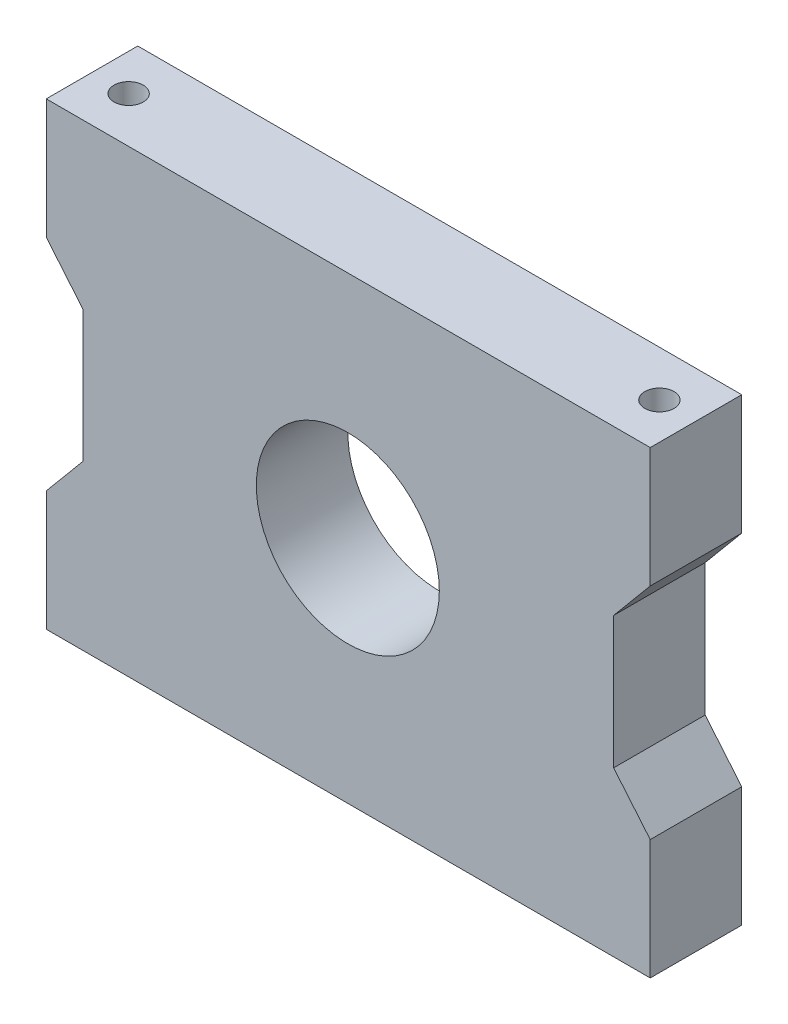
ISO-10303-21;
HEADER;
FILE_DESCRIPTION(('STEP AP214'),'2;1');
FILE_NAME('part.step','',(''),(''),'','','');
FILE_SCHEMA(('AUTOMOTIVE_DESIGN { 1 0 10303 214 1 1 1 1 }'));
ENDSEC;
DATA;
#1=APPLICATION_CONTEXT('core data for automotive mechanical design processes');
#2=APPLICATION_PROTOCOL_DEFINITION('international standard','automotive_design',2000,#1);
#3=PRODUCT_CONTEXT('',#1,'mechanical');
#4=PRODUCT('Part','Part','',(#3));
#5=PRODUCT_RELATED_PRODUCT_CATEGORY('part','',(#4));
#6=PRODUCT_DEFINITION_FORMATION('','',#4);
#7=PRODUCT_DEFINITION_CONTEXT('part definition',#1,'design');
#8=PRODUCT_DEFINITION('design','',#6,#7);
#9=PRODUCT_DEFINITION_SHAPE('','',#8);
#10=(LENGTH_UNIT() NAMED_UNIT(*) SI_UNIT(.MILLI.,.METRE.));
#11=(NAMED_UNIT(*) PLANE_ANGLE_UNIT() SI_UNIT($,.RADIAN.));
#12=(NAMED_UNIT(*) SI_UNIT($,.STERADIAN.) SOLID_ANGLE_UNIT());
#13=UNCERTAINTY_MEASURE_WITH_UNIT(LENGTH_MEASURE(1.E-05),#10,'distance_accuracy_value','');
#14=(GEOMETRIC_REPRESENTATION_CONTEXT(3) GLOBAL_UNCERTAINTY_ASSIGNED_CONTEXT((#13)) GLOBAL_UNIT_ASSIGNED_CONTEXT((#10,
#11,#12)) REPRESENTATION_CONTEXT('',''));
#15=CARTESIAN_POINT('',(0.,0.,0.));
#16=DIRECTION('',(0.,0.,1.));
#17=DIRECTION('',(1.,0.,0.));
#18=AXIS2_PLACEMENT_3D('',#15,#16,#17);
#19=CARTESIAN_POINT('',(0.,0.,10.));
#20=DIRECTION('',(0.,0.,1.));
#21=DIRECTION('',(1.,0.,0.));
#22=AXIS2_PLACEMENT_3D('',#19,#20,#21);
#23=PLANE('',#22);
#24=DIRECTION('',(0.,-1.,0.));
#25=VECTOR('',#24,1.);
#26=CARTESIAN_POINT('',(0.,0.,10.));
#27=LINE('',#26,#25);
#28=CARTESIAN_POINT('',(0.,13.1,10.));
#29=VERTEX_POINT('',#28);
#30=CARTESIAN_POINT('',(0.,0.,10.));
#31=VERTEX_POINT('',#30);
#32=EDGE_CURVE('E202',#29,#31,#27,.T.);
#33=ORIENTED_EDGE('',*,*,#32,.T.);
#34=DIRECTION('',(1.,0.,0.));
#35=VECTOR('',#34,1.);
#36=CARTESIAN_POINT('',(0.,0.,10.));
#37=LINE('',#36,#35);
#38=CARTESIAN_POINT('',(66.,0.,10.));
#39=VERTEX_POINT('',#38);
#40=EDGE_CURVE('E114',#31,#39,#37,.T.);
#41=ORIENTED_EDGE('',*,*,#40,.T.);
#42=DIRECTION('',(0.,1.,0.));
#43=VECTOR('',#42,1.);
#44=CARTESIAN_POINT('',(66.,0.,10.));
#45=LINE('',#44,#43);
#46=CARTESIAN_POINT('',(66.,13.1,10.));
#47=VERTEX_POINT('',#46);
#48=EDGE_CURVE('E239',#39,#47,#45,.T.);
#49=ORIENTED_EDGE('',*,*,#48,.T.);
#50=DIRECTION('',(-0.641215926832567,0.767360498837575,0.));
#51=VECTOR('',#50,1.);
#52=CARTESIAN_POINT('',(66.,13.1,10.));
#53=LINE('',#52,#51);
#54=CARTESIAN_POINT('',(62.,17.8869085387703,10.));
#55=VERTEX_POINT('',#54);
#56=EDGE_CURVE('E259',#47,#55,#53,.T.);
#57=ORIENTED_EDGE('',*,*,#56,.T.);
#58=DIRECTION('',(0.,1.,0.));
#59=VECTOR('',#58,1.);
#60=CARTESIAN_POINT('',(62.,17.8869085387703,10.));
#61=LINE('',#60,#59);
#62=CARTESIAN_POINT('',(62.,32.3130914612297,10.));
#63=VERTEX_POINT('',#62);
#64=EDGE_CURVE('E255',#55,#63,#61,.T.);
#65=ORIENTED_EDGE('',*,*,#64,.T.);
#66=DIRECTION('',(0.641215926832567,0.767360498837575,0.));
#67=VECTOR('',#66,1.);
#68=CARTESIAN_POINT('',(66.,37.1,10.));
#69=LINE('',#68,#67);
#70=CARTESIAN_POINT('',(66.,37.1,10.));
#71=VERTEX_POINT('',#70);
#72=EDGE_CURVE('E258',#63,#71,#69,.T.);
#73=ORIENTED_EDGE('',*,*,#72,.T.);
#74=DIRECTION('',(0.,1.,0.));
#75=VECTOR('',#74,1.);
#76=CARTESIAN_POINT('',(66.,50.2,10.));
#77=LINE('',#76,#75);
#78=CARTESIAN_POINT('',(66.,50.2,10.));
#79=VERTEX_POINT('',#78);
#80=EDGE_CURVE('E263',#71,#79,#77,.T.);
#81=ORIENTED_EDGE('',*,*,#80,.T.);
#82=DIRECTION('',(-1.,0.,0.));
#83=VECTOR('',#82,1.);
#84=CARTESIAN_POINT('',(66.,50.2,10.));
#85=LINE('',#84,#83);
#86=CARTESIAN_POINT('',(0.,50.2,10.));
#87=VERTEX_POINT('',#86);
#88=EDGE_CURVE('E270',#79,#87,#85,.T.);
#89=ORIENTED_EDGE('',*,*,#88,.T.);
#90=DIRECTION('',(0.,-1.,0.));
#91=VECTOR('',#90,1.);
#92=CARTESIAN_POINT('',(0.,50.2,10.));
#93=LINE('',#92,#91);
#94=CARTESIAN_POINT('',(0.,37.1,10.));
#95=VERTEX_POINT('',#94);
#96=EDGE_CURVE('E145',#87,#95,#93,.T.);
#97=ORIENTED_EDGE('',*,*,#96,.T.);
#98=DIRECTION('',(0.641215926832567,-0.767360498837575,0.));
#99=VECTOR('',#98,1.);
#100=CARTESIAN_POINT('',(0.,37.1,10.));
#101=LINE('',#100,#99);
#102=CARTESIAN_POINT('',(4.,32.3130914612297,10.));
#103=VERTEX_POINT('',#102);
#104=EDGE_CURVE('E139',#95,#103,#101,.T.);
#105=ORIENTED_EDGE('',*,*,#104,.T.);
#106=DIRECTION('',(0.,-1.,0.));
#107=VECTOR('',#106,1.);
#108=CARTESIAN_POINT('',(4.,17.8869085387703,10.));
#109=LINE('',#108,#107);
#110=CARTESIAN_POINT('',(4.,17.8869085387703,10.));
#111=VERTEX_POINT('',#110);
#112=EDGE_CURVE('E143',#103,#111,#109,.T.);
#113=ORIENTED_EDGE('',*,*,#112,.T.);
#114=DIRECTION('',(-0.641215926832567,-0.767360498837575,0.));
#115=VECTOR('',#114,1.);
#116=CARTESIAN_POINT('',(0.,13.1,10.));
#117=LINE('',#116,#115);
#118=EDGE_CURVE('E59',#111,#29,#117,.T.);
#119=ORIENTED_EDGE('',*,*,#118,.T.);
#120=EDGE_LOOP('',(#33,#41,#49,#57,#65,#73,#81,#89,#97,#105,#113,#119));
#121=FACE_BOUND('',#120,.T.);
#122=CARTESIAN_POINT('',(32.9524080393924,25.1,10.));
#123=DIRECTION('',(0.,0.,1.));
#124=DIRECTION('',(1.,0.,0.));
#125=AXIS2_PLACEMENT_3D('',#122,#123,#124);
#126=CIRCLE('',#125,10.);
#127=CARTESIAN_POINT('',(42.9524080393924,25.1,10.));
#128=VERTEX_POINT('',#127);
#129=EDGE_CURVE('E172',#128,#128,#126,.T.);
#130=ORIENTED_EDGE('',*,*,#129,.F.);
#131=EDGE_LOOP('',(#130));
#132=FACE_BOUND('',#131,.T.);
#133=ADVANCED_FACE('F41',(#121,#132),#23,.T.);
#134=CARTESIAN_POINT('',(0.,0.,0.));
#135=DIRECTION('',(0.,0.,1.));
#136=DIRECTION('',(1.,0.,0.));
#137=AXIS2_PLACEMENT_3D('',#134,#135,#136);
#138=PLANE('',#137);
#139=DIRECTION('',(0.,-1.,0.));
#140=VECTOR('',#139,1.);
#141=CARTESIAN_POINT('',(0.,0.,0.));
#142=LINE('',#141,#140);
#143=CARTESIAN_POINT('',(0.,13.1,0.));
#144=VERTEX_POINT('',#143);
#145=CARTESIAN_POINT('',(0.,0.,0.));
#146=VERTEX_POINT('',#145);
#147=EDGE_CURVE('E167',#144,#146,#142,.T.);
#148=ORIENTED_EDGE('',*,*,#147,.F.);
#149=DIRECTION('',(-0.641215926832567,-0.767360498837575,0.));
#150=VECTOR('',#149,1.);
#151=CARTESIAN_POINT('',(0.,13.1,0.));
#152=LINE('',#151,#150);
#153=CARTESIAN_POINT('',(4.,17.8869085387703,0.));
#154=VERTEX_POINT('',#153);
#155=EDGE_CURVE('E106',#154,#144,#152,.T.);
#156=ORIENTED_EDGE('',*,*,#155,.F.);
#157=DIRECTION('',(0.,-1.,0.));
#158=VECTOR('',#157,1.);
#159=CARTESIAN_POINT('',(4.,17.8869085387703,0.));
#160=LINE('',#159,#158);
#161=CARTESIAN_POINT('',(4.,32.3130914612297,0.));
#162=VERTEX_POINT('',#161);
#163=EDGE_CURVE('E100',#162,#154,#160,.T.);
#164=ORIENTED_EDGE('',*,*,#163,.F.);
#165=DIRECTION('',(0.641215926832567,-0.767360498837575,0.));
#166=VECTOR('',#165,1.);
#167=CARTESIAN_POINT('',(0.,37.1,0.));
#168=LINE('',#167,#166);
#169=CARTESIAN_POINT('',(0.,37.1,0.));
#170=VERTEX_POINT('',#169);
#171=EDGE_CURVE('E154',#170,#162,#168,.T.);
#172=ORIENTED_EDGE('',*,*,#171,.F.);
#173=DIRECTION('',(0.,-1.,0.));
#174=VECTOR('',#173,1.);
#175=CARTESIAN_POINT('',(0.,50.2,0.));
#176=LINE('',#175,#174);
#177=CARTESIAN_POINT('',(0.,50.2,0.));
#178=VERTEX_POINT('',#177);
#179=EDGE_CURVE('E193',#178,#170,#176,.T.);
#180=ORIENTED_EDGE('',*,*,#179,.F.);
#181=DIRECTION('',(-1.,0.,0.));
#182=VECTOR('',#181,1.);
#183=CARTESIAN_POINT('',(66.,50.2,0.));
#184=LINE('',#183,#182);
#185=CARTESIAN_POINT('',(66.,50.2,0.));
#186=VERTEX_POINT('',#185);
#187=EDGE_CURVE('E190',#186,#178,#184,.T.);
#188=ORIENTED_EDGE('',*,*,#187,.F.);
#189=DIRECTION('',(0.,1.,0.));
#190=VECTOR('',#189,1.);
#191=CARTESIAN_POINT('',(66.,50.2,0.));
#192=LINE('',#191,#190);
#193=CARTESIAN_POINT('',(66.,37.1,0.));
#194=VERTEX_POINT('',#193);
#195=EDGE_CURVE('E187',#194,#186,#192,.T.);
#196=ORIENTED_EDGE('',*,*,#195,.F.);
#197=DIRECTION('',(0.641215926832567,0.767360498837575,0.));
#198=VECTOR('',#197,1.);
#199=CARTESIAN_POINT('',(66.,37.1,0.));
#200=LINE('',#199,#198);
#201=CARTESIAN_POINT('',(62.,32.3130914612297,0.));
#202=VERTEX_POINT('',#201);
#203=EDGE_CURVE('E184',#202,#194,#200,.T.);
#204=ORIENTED_EDGE('',*,*,#203,.F.);
#205=DIRECTION('',(0.,1.,0.));
#206=VECTOR('',#205,1.);
#207=CARTESIAN_POINT('',(62.,17.8869085387703,0.));
#208=LINE('',#207,#206);
#209=CARTESIAN_POINT('',(62.,17.8869085387703,0.));
#210=VERTEX_POINT('',#209);
#211=EDGE_CURVE('E181',#210,#202,#208,.T.);
#212=ORIENTED_EDGE('',*,*,#211,.F.);
#213=DIRECTION('',(-0.641215926832567,0.767360498837575,0.));
#214=VECTOR('',#213,1.);
#215=CARTESIAN_POINT('',(66.,13.1,0.));
#216=LINE('',#215,#214);
#217=CARTESIAN_POINT('',(66.,13.1,0.));
#218=VERTEX_POINT('',#217);
#219=EDGE_CURVE('E178',#218,#210,#216,.T.);
#220=ORIENTED_EDGE('',*,*,#219,.F.);
#221=DIRECTION('',(0.,1.,0.));
#222=VECTOR('',#221,1.);
#223=CARTESIAN_POINT('',(66.,0.,0.));
#224=LINE('',#223,#222);
#225=CARTESIAN_POINT('',(66.,0.,0.));
#226=VERTEX_POINT('',#225);
#227=EDGE_CURVE('E175',#226,#218,#224,.T.);
#228=ORIENTED_EDGE('',*,*,#227,.F.);
#229=DIRECTION('',(1.,0.,0.));
#230=VECTOR('',#229,1.);
#231=CARTESIAN_POINT('',(0.,0.,0.));
#232=LINE('',#231,#230);
#233=EDGE_CURVE('E171',#146,#226,#232,.T.);
#234=ORIENTED_EDGE('',*,*,#233,.F.);
#235=EDGE_LOOP('',(#148,#156,#164,#172,#180,#188,#196,#204,#212,#220,#228,#234));
#236=FACE_BOUND('',#235,.T.);
#237=CARTESIAN_POINT('',(32.9524080393924,25.1,0.));
#238=DIRECTION('',(0.,0.,1.));
#239=DIRECTION('',(1.,0.,0.));
#240=AXIS2_PLACEMENT_3D('',#237,#238,#239);
#241=CIRCLE('',#240,10.);
#242=CARTESIAN_POINT('',(42.9524080393924,25.1,0.));
#243=VERTEX_POINT('',#242);
#244=EDGE_CURVE('E364',#243,#243,#241,.T.);
#245=ORIENTED_EDGE('',*,*,#244,.T.);
#246=EDGE_LOOP('',(#245));
#247=FACE_BOUND('',#246,.T.);
#248=ADVANCED_FACE('F243',(#236,#247),#138,.F.);
#249=CARTESIAN_POINT('',(0.,0.,10.));
#250=DIRECTION('',(1.,0.,0.));
#251=DIRECTION('',(0.,0.,-1.));
#252=AXIS2_PLACEMENT_3D('',#249,#250,#251);
#253=PLANE('',#252);
#254=ORIENTED_EDGE('',*,*,#147,.T.);
#255=DIRECTION('',(0.,0.,-1.));
#256=VECTOR('',#255,1.);
#257=CARTESIAN_POINT('',(0.,0.,10.));
#258=LINE('',#257,#256);
#259=EDGE_CURVE('E11',#31,#146,#258,.T.);
#260=ORIENTED_EDGE('',*,*,#259,.F.);
#261=ORIENTED_EDGE('',*,*,#32,.F.);
#262=DIRECTION('',(0.,0.,-1.));
#263=VECTOR('',#262,1.);
#264=CARTESIAN_POINT('',(0.,13.1,10.));
#265=LINE('',#264,#263);
#266=EDGE_CURVE('E163',#29,#144,#265,.T.);
#267=ORIENTED_EDGE('',*,*,#266,.T.);
#268=EDGE_LOOP('',(#254,#260,#261,#267));
#269=FACE_BOUND('',#268,.T.);
#270=ADVANCED_FACE('F43',(#269),#253,.F.);
#271=CARTESIAN_POINT('',(0.,0.,10.));
#272=DIRECTION('',(0.,1.,0.));
#273=DIRECTION('',(0.,0.,1.));
#274=AXIS2_PLACEMENT_3D('',#271,#272,#273);
#275=PLANE('',#274);
#276=CARTESIAN_POINT('',(4.,0.,5.));
#277=DIRECTION('',(0.,1.,0.));
#278=DIRECTION('',(0.,0.,1.));
#279=AXIS2_PLACEMENT_3D('',#276,#277,#278);
#280=CIRCLE('',#279,1.6);
#281=CARTESIAN_POINT('',(4.,0.,6.6));
#282=VERTEX_POINT('',#281);
#283=EDGE_CURVE('E342',#282,#282,#280,.T.);
#284=ORIENTED_EDGE('',*,*,#283,.T.);
#285=EDGE_LOOP('',(#284));
#286=FACE_BOUND('',#285,.T.);
#287=CARTESIAN_POINT('',(62.,0.,4.99999999999999));
#288=DIRECTION('',(0.,1.,0.));
#289=DIRECTION('',(0.,0.,-1.));
#290=AXIS2_PLACEMENT_3D('',#287,#288,#289);
#291=CIRCLE('',#290,1.60000000000001);
#292=CARTESIAN_POINT('',(62.,0.,3.39999999999999));
#293=VERTEX_POINT('',#292);
#294=EDGE_CURVE('E356',#293,#293,#291,.T.);
#295=ORIENTED_EDGE('',*,*,#294,.T.);
#296=EDGE_LOOP('',(#295));
#297=FACE_BOUND('',#296,.T.);
#298=ORIENTED_EDGE('',*,*,#233,.T.);
#299=DIRECTION('',(0.,0.,-1.));
#300=VECTOR('',#299,1.);
#301=CARTESIAN_POINT('',(66.,0.,10.));
#302=LINE('',#301,#300);
#303=EDGE_CURVE('E51',#39,#226,#302,.T.);
#304=ORIENTED_EDGE('',*,*,#303,.F.);
#305=ORIENTED_EDGE('',*,*,#40,.F.);
#306=ORIENTED_EDGE('',*,*,#259,.T.);
#307=EDGE_LOOP('',(#298,#304,#305,#306));
#308=FACE_BOUND('',#307,.T.);
#309=ADVANCED_FACE('F412',(#286,#297,#308),#275,.F.);
#310=CARTESIAN_POINT('',(66.,0.,10.));
#311=DIRECTION('',(-1.,0.,0.));
#312=DIRECTION('',(0.,0.,1.));
#313=AXIS2_PLACEMENT_3D('',#310,#311,#312);
#314=PLANE('',#313);
#315=ORIENTED_EDGE('',*,*,#227,.T.);
#316=DIRECTION('',(0.,0.,-1.));
#317=VECTOR('',#316,1.);
#318=CARTESIAN_POINT('',(66.,13.1,10.));
#319=LINE('',#318,#317);
#320=EDGE_CURVE('E229',#47,#218,#319,.T.);
#321=ORIENTED_EDGE('',*,*,#320,.F.);
#322=ORIENTED_EDGE('',*,*,#48,.F.);
#323=ORIENTED_EDGE('',*,*,#303,.T.);
#324=EDGE_LOOP('',(#315,#321,#322,#323));
#325=FACE_BOUND('',#324,.T.);
#326=ADVANCED_FACE('F237',(#325),#314,.F.);
#327=CARTESIAN_POINT('',(66.,13.1,10.));
#328=DIRECTION('',(-0.767360498837575,-0.641215926832567,0.));
#329=DIRECTION('',(0.641215926832567,-0.767360498837575,0.));
#330=AXIS2_PLACEMENT_3D('',#327,#328,#329);
#331=PLANE('',#330);
#332=ORIENTED_EDGE('',*,*,#219,.T.);
#333=DIRECTION('',(0.,0.,-1.));
#334=VECTOR('',#333,1.);
#335=CARTESIAN_POINT('',(62.,17.8869085387703,10.));
#336=LINE('',#335,#334);
#337=EDGE_CURVE('E225',#55,#210,#336,.T.);
#338=ORIENTED_EDGE('',*,*,#337,.F.);
#339=ORIENTED_EDGE('',*,*,#56,.F.);
#340=ORIENTED_EDGE('',*,*,#320,.T.);
#341=EDGE_LOOP('',(#332,#338,#339,#340));
#342=FACE_BOUND('',#341,.T.);
#343=ADVANCED_FACE('F249',(#342),#331,.F.);
#344=CARTESIAN_POINT('',(62.,17.8869085387703,10.));
#345=DIRECTION('',(-1.,0.,0.));
#346=DIRECTION('',(0.,0.,1.));
#347=AXIS2_PLACEMENT_3D('',#344,#345,#346);
#348=PLANE('',#347);
#349=ORIENTED_EDGE('',*,*,#211,.T.);
#350=DIRECTION('',(0.,0.,-1.));
#351=VECTOR('',#350,1.);
#352=CARTESIAN_POINT('',(62.,32.3130914612297,10.));
#353=LINE('',#352,#351);
#354=EDGE_CURVE('E221',#63,#202,#353,.T.);
#355=ORIENTED_EDGE('',*,*,#354,.F.);
#356=ORIENTED_EDGE('',*,*,#64,.F.);
#357=ORIENTED_EDGE('',*,*,#337,.T.);
#358=EDGE_LOOP('',(#349,#355,#356,#357));
#359=FACE_BOUND('',#358,.T.);
#360=ADVANCED_FACE('F253',(#359),#348,.F.);
#361=CARTESIAN_POINT('',(66.,37.1,10.));
#362=DIRECTION('',(-0.767360498837575,0.641215926832567,0.));
#363=DIRECTION('',(-0.641215926832567,-0.767360498837575,0.));
#364=AXIS2_PLACEMENT_3D('',#361,#362,#363);
#365=PLANE('',#364);
#366=ORIENTED_EDGE('',*,*,#203,.T.);
#367=DIRECTION('',(0.,0.,-1.));
#368=VECTOR('',#367,1.);
#369=CARTESIAN_POINT('',(66.,37.1,10.));
#370=LINE('',#369,#368);
#371=EDGE_CURVE('E217',#71,#194,#370,.T.);
#372=ORIENTED_EDGE('',*,*,#371,.F.);
#373=ORIENTED_EDGE('',*,*,#72,.F.);
#374=ORIENTED_EDGE('',*,*,#354,.T.);
#375=EDGE_LOOP('',(#366,#372,#373,#374));
#376=FACE_BOUND('',#375,.T.);
#377=ADVANCED_FACE('F398',(#376),#365,.F.);
#378=CARTESIAN_POINT('',(66.,50.2,10.));
#379=DIRECTION('',(-1.,0.,0.));
#380=DIRECTION('',(0.,0.,1.));
#381=AXIS2_PLACEMENT_3D('',#378,#379,#380);
#382=PLANE('',#381);
#383=ORIENTED_EDGE('',*,*,#195,.T.);
#384=DIRECTION('',(0.,0.,-1.));
#385=VECTOR('',#384,1.);
#386=CARTESIAN_POINT('',(66.,50.2,10.));
#387=LINE('',#386,#385);
#388=EDGE_CURVE('E213',#79,#186,#387,.T.);
#389=ORIENTED_EDGE('',*,*,#388,.F.);
#390=ORIENTED_EDGE('',*,*,#80,.F.);
#391=ORIENTED_EDGE('',*,*,#371,.T.);
#392=EDGE_LOOP('',(#383,#389,#390,#391));
#393=FACE_BOUND('',#392,.T.);
#394=ADVANCED_FACE('F390',(#393),#382,.F.);
#395=CARTESIAN_POINT('',(66.,50.2,10.));
#396=DIRECTION('',(0.,-1.,0.));
#397=DIRECTION('',(0.,0.,-1.));
#398=AXIS2_PLACEMENT_3D('',#395,#396,#397);
#399=PLANE('',#398);
#400=CARTESIAN_POINT('',(4.,50.2,5.));
#401=DIRECTION('',(0.,1.,0.));
#402=DIRECTION('',(0.,0.,1.));
#403=AXIS2_PLACEMENT_3D('',#400,#401,#402);
#404=CIRCLE('',#403,1.6);
#405=CARTESIAN_POINT('',(4.,50.2,6.6));
#406=VERTEX_POINT('',#405);
#407=EDGE_CURVE('E365',#406,#406,#404,.T.);
#408=ORIENTED_EDGE('',*,*,#407,.F.);
#409=EDGE_LOOP('',(#408));
#410=FACE_BOUND('',#409,.T.);
#411=CARTESIAN_POINT('',(62.,50.2,4.99999999999999));
#412=DIRECTION('',(0.,1.,0.));
#413=DIRECTION('',(0.,0.,-1.));
#414=AXIS2_PLACEMENT_3D('',#411,#412,#413);
#415=CIRCLE('',#414,1.60000000000001);
#416=CARTESIAN_POINT('',(62.,50.2,3.39999999999999));
#417=VERTEX_POINT('',#416);
#418=EDGE_CURVE('E341',#417,#417,#415,.T.);
#419=ORIENTED_EDGE('',*,*,#418,.F.);
#420=EDGE_LOOP('',(#419));
#421=FACE_BOUND('',#420,.T.);
#422=ORIENTED_EDGE('',*,*,#187,.T.);
#423=DIRECTION('',(0.,0.,-1.));
#424=VECTOR('',#423,1.);
#425=CARTESIAN_POINT('',(0.,50.2,10.));
#426=LINE('',#425,#424);
#427=EDGE_CURVE('E209',#87,#178,#426,.T.);
#428=ORIENTED_EDGE('',*,*,#427,.F.);
#429=ORIENTED_EDGE('',*,*,#88,.F.);
#430=ORIENTED_EDGE('',*,*,#388,.T.);
#431=EDGE_LOOP('',(#422,#428,#429,#430));
#432=FACE_BOUND('',#431,.T.);
#433=ADVANCED_FACE('F278',(#410,#421,#432),#399,.F.);
#434=CARTESIAN_POINT('',(0.,50.2,10.));
#435=DIRECTION('',(1.,0.,0.));
#436=DIRECTION('',(0.,0.,-1.));
#437=AXIS2_PLACEMENT_3D('',#434,#435,#436);
#438=PLANE('',#437);
#439=ORIENTED_EDGE('',*,*,#179,.T.);
#440=DIRECTION('',(0.,0.,-1.));
#441=VECTOR('',#440,1.);
#442=CARTESIAN_POINT('',(0.,37.1,10.));
#443=LINE('',#442,#441);
#444=EDGE_CURVE('E156',#95,#170,#443,.T.);
#445=ORIENTED_EDGE('',*,*,#444,.F.);
#446=ORIENTED_EDGE('',*,*,#96,.F.);
#447=ORIENTED_EDGE('',*,*,#427,.T.);
#448=EDGE_LOOP('',(#439,#445,#446,#447));
#449=FACE_BOUND('',#448,.T.);
#450=ADVANCED_FACE('F282',(#449),#438,.F.);
#451=CARTESIAN_POINT('',(0.,37.1,10.));
#452=DIRECTION('',(0.767360498837575,0.641215926832567,0.));
#453=DIRECTION('',(-0.641215926832567,0.767360498837575,0.));
#454=AXIS2_PLACEMENT_3D('',#451,#452,#453);
#455=PLANE('',#454);
#456=ORIENTED_EDGE('',*,*,#171,.T.);
#457=DIRECTION('',(0.,0.,-1.));
#458=VECTOR('',#457,1.);
#459=CARTESIAN_POINT('',(4.,32.3130914612297,10.));
#460=LINE('',#459,#458);
#461=EDGE_CURVE('E151',#103,#162,#460,.T.);
#462=ORIENTED_EDGE('',*,*,#461,.F.);
#463=ORIENTED_EDGE('',*,*,#104,.F.);
#464=ORIENTED_EDGE('',*,*,#444,.T.);
#465=EDGE_LOOP('',(#456,#462,#463,#464));
#466=FACE_BOUND('',#465,.T.);
#467=ADVANCED_FACE('F152',(#466),#455,.F.);
#468=CARTESIAN_POINT('',(4.,17.8869085387703,10.));
#469=DIRECTION('',(1.,0.,0.));
#470=DIRECTION('',(0.,0.,-1.));
#471=AXIS2_PLACEMENT_3D('',#468,#469,#470);
#472=PLANE('',#471);
#473=ORIENTED_EDGE('',*,*,#163,.T.);
#474=DIRECTION('',(0.,0.,-1.));
#475=VECTOR('',#474,1.);
#476=CARTESIAN_POINT('',(4.,17.8869085387703,10.));
#477=LINE('',#476,#475);
#478=EDGE_CURVE('E157',#111,#154,#477,.T.);
#479=ORIENTED_EDGE('',*,*,#478,.F.);
#480=ORIENTED_EDGE('',*,*,#112,.F.);
#481=ORIENTED_EDGE('',*,*,#461,.T.);
#482=EDGE_LOOP('',(#473,#479,#480,#481));
#483=FACE_BOUND('',#482,.T.);
#484=ADVANCED_FACE('F159',(#483),#472,.F.);
#485=CARTESIAN_POINT('',(0.,13.1,10.));
#486=DIRECTION('',(0.767360498837575,-0.641215926832567,0.));
#487=DIRECTION('',(0.641215926832567,0.767360498837575,0.));
#488=AXIS2_PLACEMENT_3D('',#485,#486,#487);
#489=PLANE('',#488);
#490=ORIENTED_EDGE('',*,*,#155,.T.);
#491=ORIENTED_EDGE('',*,*,#266,.F.);
#492=ORIENTED_EDGE('',*,*,#118,.F.);
#493=ORIENTED_EDGE('',*,*,#478,.T.);
#494=EDGE_LOOP('',(#490,#491,#492,#493));
#495=FACE_BOUND('',#494,.T.);
#496=ADVANCED_FACE('F286',(#495),#489,.F.);
#497=CARTESIAN_POINT('',(32.9524080393924,25.1,10.));
#498=DIRECTION('',(0.,0.,-1.));
#499=DIRECTION('',(-1.,0.,0.));
#500=AXIS2_PLACEMENT_3D('',#497,#498,#499);
#501=CYLINDRICAL_SURFACE('',#500,10.);
#502=ORIENTED_EDGE('',*,*,#129,.T.);
#503=EDGE_LOOP('',(#502));
#504=FACE_BOUND('',#503,.T.);
#505=ORIENTED_EDGE('',*,*,#244,.F.);
#506=EDGE_LOOP('',(#505));
#507=FACE_BOUND('',#506,.T.);
#508=ADVANCED_FACE('F288',(#504,#507),#501,.F.);
#509=CARTESIAN_POINT('',(62.,40.2,4.99999999999999));
#510=DIRECTION('',(0.,1.,0.));
#511=DIRECTION('',(0.,0.,1.));
#512=AXIS2_PLACEMENT_3D('',#509,#510,#511);
#513=CYLINDRICAL_SURFACE('',#512,1.60000000000001);
#514=CARTESIAN_POINT('',(62.,40.2,4.99999999999999));
#515=DIRECTION('',(0.,1.,0.));
#516=DIRECTION('',(0.,0.,-1.));
#517=AXIS2_PLACEMENT_3D('',#514,#515,#516);
#518=CIRCLE('',#517,1.60000000000001);
#519=CARTESIAN_POINT('',(62.,40.2,3.39999999999999));
#520=VERTEX_POINT('',#519);
#521=EDGE_CURVE('E347',#520,#520,#518,.T.);
#522=ORIENTED_EDGE('',*,*,#521,.F.);
#523=EDGE_LOOP('',(#522));
#524=FACE_BOUND('',#523,.T.);
#525=ORIENTED_EDGE('',*,*,#418,.T.);
#526=EDGE_LOOP('',(#525));
#527=FACE_BOUND('',#526,.T.);
#528=ADVANCED_FACE('F294',(#524,#527),#513,.F.);
#529=CARTESIAN_POINT('',(62.,40.2,4.99999999999999));
#530=DIRECTION('',(0.,-1.,0.));
#531=DIRECTION('',(0.,0.,-1.));
#532=AXIS2_PLACEMENT_3D('',#529,#530,#531);
#533=PLANE('',#532);
#534=ORIENTED_EDGE('',*,*,#521,.T.);
#535=EDGE_LOOP('',(#534));
#536=FACE_BOUND('',#535,.T.);
#537=ADVANCED_FACE('F307',(#536),#533,.F.);
#538=CARTESIAN_POINT('',(4.,40.2,5.));
#539=DIRECTION('',(0.,1.,0.));
#540=DIRECTION('',(0.,0.,1.));
#541=AXIS2_PLACEMENT_3D('',#538,#539,#540);
#542=CYLINDRICAL_SURFACE('',#541,1.6);
#543=CARTESIAN_POINT('',(4.,40.2,5.));
#544=DIRECTION('',(0.,1.,0.));
#545=DIRECTION('',(0.,0.,1.));
#546=AXIS2_PLACEMENT_3D('',#543,#544,#545);
#547=CIRCLE('',#546,1.6);
#548=CARTESIAN_POINT('',(4.,40.2,6.6));
#549=VERTEX_POINT('',#548);
#550=EDGE_CURVE('E360',#549,#549,#547,.T.);
#551=ORIENTED_EDGE('',*,*,#550,.F.);
#552=EDGE_LOOP('',(#551));
#553=FACE_BOUND('',#552,.T.);
#554=ORIENTED_EDGE('',*,*,#407,.T.);
#555=EDGE_LOOP('',(#554));
#556=FACE_BOUND('',#555,.T.);
#557=ADVANCED_FACE('F311',(#553,#556),#542,.F.);
#558=CARTESIAN_POINT('',(4.,40.2,5.));
#559=DIRECTION('',(0.,1.,0.));
#560=DIRECTION('',(0.,0.,1.));
#561=AXIS2_PLACEMENT_3D('',#558,#559,#560);
#562=PLANE('',#561);
#563=ORIENTED_EDGE('',*,*,#550,.T.);
#564=EDGE_LOOP('',(#563));
#565=FACE_BOUND('',#564,.T.);
#566=ADVANCED_FACE('F315',(#565),#562,.T.);
#567=CARTESIAN_POINT('',(62.,10.,4.99999999999999));
#568=DIRECTION('',(0.,-1.,0.));
#569=DIRECTION('',(0.,0.,-1.));
#570=AXIS2_PLACEMENT_3D('',#567,#568,#569);
#571=CYLINDRICAL_SURFACE('',#570,1.60000000000001);
#572=CARTESIAN_POINT('',(62.,10.,4.99999999999999));
#573=DIRECTION('',(0.,1.,0.));
#574=DIRECTION('',(0.,0.,-1.));
#575=AXIS2_PLACEMENT_3D('',#572,#573,#574);
#576=CIRCLE('',#575,1.60000000000001);
#577=CARTESIAN_POINT('',(62.,10.,3.39999999999999));
#578=VERTEX_POINT('',#577);
#579=EDGE_CURVE('E350',#578,#578,#576,.T.);
#580=ORIENTED_EDGE('',*,*,#579,.T.);
#581=EDGE_LOOP('',(#580));
#582=FACE_BOUND('',#581,.T.);
#583=ORIENTED_EDGE('',*,*,#294,.F.);
#584=EDGE_LOOP('',(#583));
#585=FACE_BOUND('',#584,.T.);
#586=ADVANCED_FACE('F319',(#582,#585),#571,.F.);
#587=CARTESIAN_POINT('',(62.,10.,4.99999999999999));
#588=DIRECTION('',(0.,1.,0.));
#589=DIRECTION('',(0.,0.,-1.));
#590=AXIS2_PLACEMENT_3D('',#587,#588,#589);
#591=PLANE('',#590);
#592=ORIENTED_EDGE('',*,*,#579,.F.);
#593=EDGE_LOOP('',(#592));
#594=FACE_BOUND('',#593,.T.);
#595=ADVANCED_FACE('F323',(#594),#591,.F.);
#596=CARTESIAN_POINT('',(4.,10.,5.));
#597=DIRECTION('',(0.,-1.,0.));
#598=DIRECTION('',(0.,0.,-1.));
#599=AXIS2_PLACEMENT_3D('',#596,#597,#598);
#600=CYLINDRICAL_SURFACE('',#599,1.6);
#601=CARTESIAN_POINT('',(4.,10.,5.));
#602=DIRECTION('',(0.,1.,0.));
#603=DIRECTION('',(0.,0.,1.));
#604=AXIS2_PLACEMENT_3D('',#601,#602,#603);
#605=CIRCLE('',#604,1.6);
#606=CARTESIAN_POINT('',(4.,10.,6.6));
#607=VERTEX_POINT('',#606);
#608=EDGE_CURVE('E339',#607,#607,#605,.T.);
#609=ORIENTED_EDGE('',*,*,#608,.T.);
#610=EDGE_LOOP('',(#609));
#611=FACE_BOUND('',#610,.T.);
#612=ORIENTED_EDGE('',*,*,#283,.F.);
#613=EDGE_LOOP('',(#612));
#614=FACE_BOUND('',#613,.T.);
#615=ADVANCED_FACE('F327',(#611,#614),#600,.F.);
#616=CARTESIAN_POINT('',(4.,10.,5.));
#617=DIRECTION('',(0.,-1.,0.));
#618=DIRECTION('',(0.,0.,1.));
#619=AXIS2_PLACEMENT_3D('',#616,#617,#618);
#620=PLANE('',#619);
#621=ORIENTED_EDGE('',*,*,#608,.F.);
#622=EDGE_LOOP('',(#621));
#623=FACE_BOUND('',#622,.T.);
#624=ADVANCED_FACE('F331',(#623),#620,.T.);
#625=CLOSED_SHELL('',(#133,#248,#270,#309,#326,#343,#360,#377,#394,#433,#450,#467,#484,#496,
#508,#528,#537,#557,#566,#586,#595,#615,#624));
#626=MANIFOLD_SOLID_BREP('B2',#625);
#627=ADVANCED_BREP_SHAPE_REPRESENTATION('',(#18,#626),#14);
#628=SHAPE_DEFINITION_REPRESENTATION(#9,#627);
ENDSEC;
END-ISO-10303-21;
